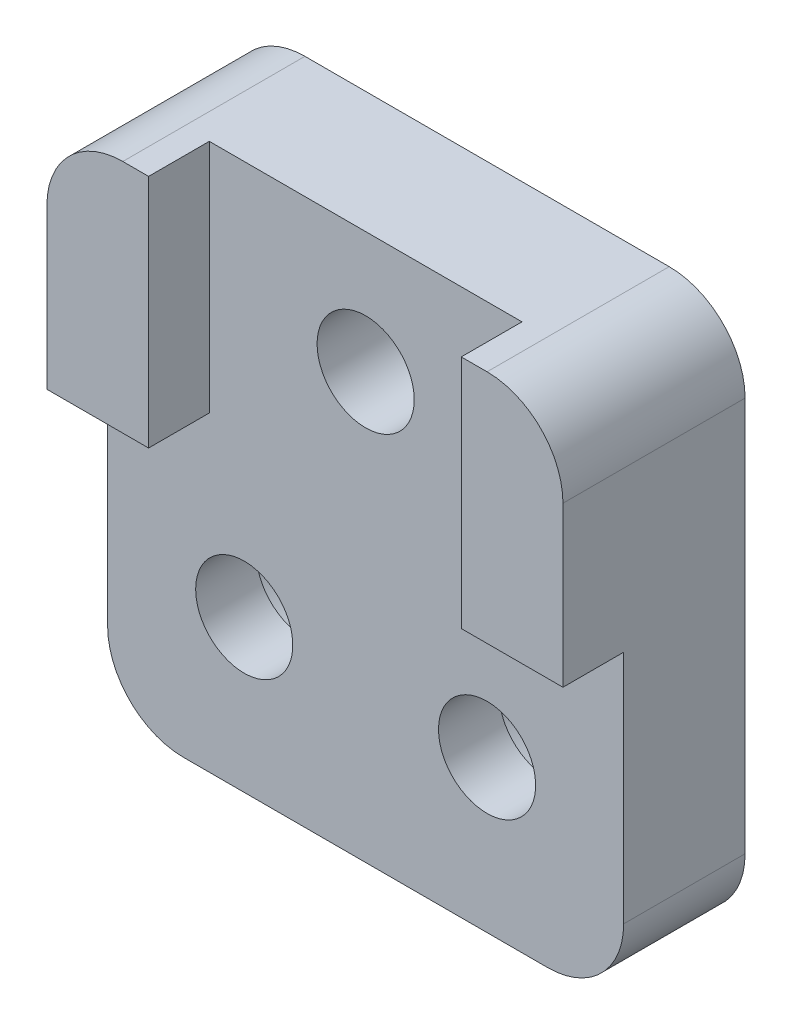
ISO-10303-21;
HEADER;
FILE_DESCRIPTION(('STEP AP214'),'2;1');
FILE_NAME('part.step','',(''),(''),'','','');
FILE_SCHEMA(('AUTOMOTIVE_DESIGN { 1 0 10303 214 1 1 1 1 }'));
ENDSEC;
DATA;
#1=APPLICATION_CONTEXT('core data for automotive mechanical design processes');
#2=APPLICATION_PROTOCOL_DEFINITION('international standard','automotive_design',2000,#1);
#3=PRODUCT_CONTEXT('',#1,'mechanical');
#4=PRODUCT('Part','Part','',(#3));
#5=PRODUCT_RELATED_PRODUCT_CATEGORY('part','',(#4));
#6=PRODUCT_DEFINITION_FORMATION('','',#4);
#7=PRODUCT_DEFINITION_CONTEXT('part definition',#1,'design');
#8=PRODUCT_DEFINITION('design','',#6,#7);
#9=PRODUCT_DEFINITION_SHAPE('','',#8);
#10=(LENGTH_UNIT() NAMED_UNIT(*) SI_UNIT(.MILLI.,.METRE.));
#11=(NAMED_UNIT(*) PLANE_ANGLE_UNIT() SI_UNIT($,.RADIAN.));
#12=(NAMED_UNIT(*) SI_UNIT($,.STERADIAN.) SOLID_ANGLE_UNIT());
#13=UNCERTAINTY_MEASURE_WITH_UNIT(LENGTH_MEASURE(1.E-05),#10,'distance_accuracy_value','');
#14=(GEOMETRIC_REPRESENTATION_CONTEXT(3) GLOBAL_UNCERTAINTY_ASSIGNED_CONTEXT((#13)) GLOBAL_UNIT_ASSIGNED_CONTEXT((#10,
#11,#12)) REPRESENTATION_CONTEXT('',''));
#15=CARTESIAN_POINT('',(0.,0.,0.));
#16=DIRECTION('',(0.,0.,1.));
#17=DIRECTION('',(1.,0.,0.));
#18=AXIS2_PLACEMENT_3D('',#15,#16,#17);
#19=CARTESIAN_POINT('',(-17.,28.,0.));
#20=DIRECTION('',(0.,0.,1.));
#21=DIRECTION('',(1.,0.,0.));
#22=AXIS2_PLACEMENT_3D('',#19,#20,#21);
#23=CYLINDRICAL_SURFACE('',#22,3.2);
#24=CARTESIAN_POINT('',(-17.00000000001,28.00000000001,4.00000000001));
#25=DIRECTION('',(0.,0.,-1.));
#26=DIRECTION('',(-1.,0.,0.));
#27=AXIS2_PLACEMENT_3D('',#24,#25,#26);
#28=CIRCLE('',#27,3.20000000001);
#29=CARTESIAN_POINT('',(-20.20000000002,28.00000000001,4.00000000001));
#30=VERTEX_POINT('',#29);
#31=EDGE_CURVE('E213',#30,#30,#28,.T.);
#32=ORIENTED_EDGE('',*,*,#31,.F.);
#33=EDGE_LOOP('',(#32));
#34=FACE_BOUND('',#33,.T.);
#35=CARTESIAN_POINT('',(-17.00000000001,28.00000000001,-4.00000000001));
#36=DIRECTION('',(0.,0.,-1.));
#37=DIRECTION('',(1.,0.,0.));
#38=AXIS2_PLACEMENT_3D('',#35,#36,#37);
#39=CIRCLE('',#38,3.20000000001);
#40=CARTESIAN_POINT('',(-13.8,28.00000000001,-4.00000000001));
#41=VERTEX_POINT('',#40);
#42=EDGE_CURVE('E11',#41,#41,#39,.T.);
#43=ORIENTED_EDGE('',*,*,#42,.T.);
#44=EDGE_LOOP('',(#43));
#45=FACE_BOUND('',#44,.T.);
#46=ADVANCED_FACE('F17',(#34,#45),#23,.F.);
#47=CARTESIAN_POINT('',(-25.,10.,0.));
#48=DIRECTION('',(0.,0.,1.));
#49=DIRECTION('',(1.,0.,0.));
#50=AXIS2_PLACEMENT_3D('',#47,#48,#49);
#51=CYLINDRICAL_SURFACE('',#50,6.);
#52=CARTESIAN_POINT('',(-25.00000000001,10.00000000001,0.));
#53=DIRECTION('',(0.,0.,-1.));
#54=DIRECTION('',(1.,0.,0.));
#55=AXIS2_PLACEMENT_3D('',#52,#53,#54);
#56=CIRCLE('',#55,6.00000000001);
#57=CARTESIAN_POINT('',(-19.,10.00000000001,0.));
#58=VERTEX_POINT('',#57);
#59=EDGE_CURVE('E224',#58,#58,#56,.T.);
#60=ORIENTED_EDGE('',*,*,#59,.F.);
#61=EDGE_LOOP('',(#60));
#62=FACE_BOUND('',#61,.T.);
#63=CARTESIAN_POINT('',(-25.00000000001,10.00000000001,-4.00000000001));
#64=DIRECTION('',(0.,0.,-1.));
#65=DIRECTION('',(1.,0.,0.));
#66=AXIS2_PLACEMENT_3D('',#63,#64,#65);
#67=CIRCLE('',#66,6.00000000001);
#68=CARTESIAN_POINT('',(-19.,10.00000000001,-4.00000000001));
#69=VERTEX_POINT('',#68);
#70=EDGE_CURVE('E28',#69,#69,#67,.T.);
#71=ORIENTED_EDGE('',*,*,#70,.T.);
#72=EDGE_LOOP('',(#71));
#73=FACE_BOUND('',#72,.T.);
#74=ADVANCED_FACE('F402',(#62,#73),#51,.F.);
#75=CARTESIAN_POINT('',(-9.,10.,0.));
#76=DIRECTION('',(0.,0.,1.));
#77=DIRECTION('',(1.,0.,0.));
#78=AXIS2_PLACEMENT_3D('',#75,#76,#77);
#79=CYLINDRICAL_SURFACE('',#78,6.);
#80=CARTESIAN_POINT('',(-9.00000000001,10.00000000001,0.));
#81=DIRECTION('',(0.,0.,-1.));
#82=DIRECTION('',(1.,0.,0.));
#83=AXIS2_PLACEMENT_3D('',#80,#81,#82);
#84=CIRCLE('',#83,6.00000000001);
#85=CARTESIAN_POINT('',(-3.,10.00000000001,0.));
#86=VERTEX_POINT('',#85);
#87=EDGE_CURVE('E221',#86,#86,#84,.T.);
#88=ORIENTED_EDGE('',*,*,#87,.F.);
#89=EDGE_LOOP('',(#88));
#90=FACE_BOUND('',#89,.T.);
#91=CARTESIAN_POINT('',(-9.00000000001,10.00000000001,-4.00000000001));
#92=DIRECTION('',(0.,0.,-1.));
#93=DIRECTION('',(1.,0.,0.));
#94=AXIS2_PLACEMENT_3D('',#91,#92,#93);
#95=CIRCLE('',#94,6.00000000001);
#96=CARTESIAN_POINT('',(-3.,10.00000000001,-4.00000000001));
#97=VERTEX_POINT('',#96);
#98=EDGE_CURVE('E275',#97,#97,#95,.T.);
#99=ORIENTED_EDGE('',*,*,#98,.T.);
#100=EDGE_LOOP('',(#99));
#101=FACE_BOUND('',#100,.T.);
#102=ADVANCED_FACE('F408',(#90,#101),#79,.F.);
#103=CARTESIAN_POINT('',(-25.,10.,0.));
#104=DIRECTION('',(0.,0.,-1.));
#105=DIRECTION('',(-1.,0.,0.));
#106=AXIS2_PLACEMENT_3D('',#103,#104,#105);
#107=CYLINDRICAL_SURFACE('',#106,3.2);
#108=CARTESIAN_POINT('',(-25.00000000001,10.00000000001,0.));
#109=DIRECTION('',(0.,0.,-1.));
#110=DIRECTION('',(-1.,0.,0.));
#111=AXIS2_PLACEMENT_3D('',#108,#109,#110);
#112=CIRCLE('',#111,3.20000000001);
#113=CARTESIAN_POINT('',(-28.20000000002,10.00000000001,0.));
#114=VERTEX_POINT('',#113);
#115=EDGE_CURVE('E318',#114,#114,#112,.T.);
#116=ORIENTED_EDGE('',*,*,#115,.T.);
#117=EDGE_LOOP('',(#116));
#118=FACE_BOUND('',#117,.T.);
#119=CARTESIAN_POINT('',(-25.00000000001,10.00000000001,4.00000000001));
#120=DIRECTION('',(0.,0.,-1.));
#121=DIRECTION('',(-1.,0.,0.));
#122=AXIS2_PLACEMENT_3D('',#119,#120,#121);
#123=CIRCLE('',#122,3.20000000001);
#124=CARTESIAN_POINT('',(-28.20000000002,10.00000000001,4.00000000001));
#125=VERTEX_POINT('',#124);
#126=EDGE_CURVE('E281',#125,#125,#123,.T.);
#127=ORIENTED_EDGE('',*,*,#126,.F.);
#128=EDGE_LOOP('',(#127));
#129=FACE_BOUND('',#128,.T.);
#130=ADVANCED_FACE('F430',(#118,#129),#107,.F.);
#131=CARTESIAN_POINT('',(-9.,10.,0.));
#132=DIRECTION('',(0.,0.,-1.));
#133=DIRECTION('',(-1.,0.,0.));
#134=AXIS2_PLACEMENT_3D('',#131,#132,#133);
#135=CYLINDRICAL_SURFACE('',#134,3.2);
#136=CARTESIAN_POINT('',(-9.00000000001,10.00000000001,0.));
#137=DIRECTION('',(0.,0.,-1.));
#138=DIRECTION('',(-1.,0.,0.));
#139=AXIS2_PLACEMENT_3D('',#136,#137,#138);
#140=CIRCLE('',#139,3.20000000001);
#141=CARTESIAN_POINT('',(-12.20000000002,10.00000000001,0.));
#142=VERTEX_POINT('',#141);
#143=EDGE_CURVE('E337',#142,#142,#140,.T.);
#144=ORIENTED_EDGE('',*,*,#143,.T.);
#145=EDGE_LOOP('',(#144));
#146=FACE_BOUND('',#145,.T.);
#147=CARTESIAN_POINT('',(-9.00000000001,10.00000000001,4.00000000001));
#148=DIRECTION('',(0.,0.,-1.));
#149=DIRECTION('',(-1.,0.,0.));
#150=AXIS2_PLACEMENT_3D('',#147,#148,#149);
#151=CIRCLE('',#150,3.20000000001);
#152=CARTESIAN_POINT('',(-12.20000000002,10.00000000001,4.00000000001));
#153=VERTEX_POINT('',#152);
#154=EDGE_CURVE('E300',#153,#153,#151,.T.);
#155=ORIENTED_EDGE('',*,*,#154,.F.);
#156=EDGE_LOOP('',(#155));
#157=FACE_BOUND('',#156,.T.);
#158=ADVANCED_FACE('F433',(#146,#157),#135,.F.);
#159=CARTESIAN_POINT('',(-5.000000000001,0.,-4.));
#160=DIRECTION('',(0.,0.,1.));
#161=DIRECTION('',(1.,0.,0.));
#162=AXIS2_PLACEMENT_3D('',#159,#160,#161);
#163=PLANE('',#162);
#164=CARTESIAN_POINT('',(-29.00000000001,5.00000000001,-4.00000000001));
#165=DIRECTION('',(0.,0.,1.));
#166=DIRECTION('',(1.,0.,0.));
#167=AXIS2_PLACEMENT_3D('',#164,#165,#166);
#168=CIRCLE('',#167,5.00000000001);
#169=CARTESIAN_POINT('',(-34.,5.,-4.));
#170=VERTEX_POINT('',#169);
#171=CARTESIAN_POINT('',(-29.,0.,-4.));
#172=VERTEX_POINT('',#171);
#173=EDGE_CURVE('E326',#170,#172,#168,.T.);
#174=ORIENTED_EDGE('',*,*,#173,.F.);
#175=DIRECTION('',(0.,-1.,0.));
#176=VECTOR('',#175,1.);
#177=CARTESIAN_POINT('',(-34.00000000001,0.,-4.00000000001));
#178=LINE('',#177,#176);
#179=CARTESIAN_POINT('',(-34.,31.0000000000005,-4.));
#180=VERTEX_POINT('',#179);
#181=EDGE_CURVE('E43',#180,#170,#178,.T.);
#182=ORIENTED_EDGE('',*,*,#181,.F.);
#183=CARTESIAN_POINT('',(-29.00000000001,31.00000000001,-4.00000000001));
#184=DIRECTION('',(0.,0.,1.));
#185=DIRECTION('',(1.,0.,0.));
#186=AXIS2_PLACEMENT_3D('',#183,#184,#185);
#187=CIRCLE('',#186,5.00000000001);
#188=CARTESIAN_POINT('',(-29.,36.,-4.));
#189=VERTEX_POINT('',#188);
#190=EDGE_CURVE('E312',#189,#180,#187,.T.);
#191=ORIENTED_EDGE('',*,*,#190,.F.);
#192=DIRECTION('',(-1.,0.,0.));
#193=VECTOR('',#192,1.);
#194=CARTESIAN_POINT('',(-5.000000000011,36.00000000001,-4.00000000001));
#195=LINE('',#194,#193);
#196=CARTESIAN_POINT('',(-4.999999999999,36.,-4.));
#197=VERTEX_POINT('',#196);
#198=EDGE_CURVE('E199',#197,#189,#195,.T.);
#199=ORIENTED_EDGE('',*,*,#198,.F.);
#200=CARTESIAN_POINT('',(-5.00000000001,31.00000000001,-4.00000000001));
#201=DIRECTION('',(0.,0.,1.));
#202=DIRECTION('',(1.,0.,0.));
#203=AXIS2_PLACEMENT_3D('',#200,#201,#202);
#204=CIRCLE('',#203,5.00000000001);
#205=CARTESIAN_POINT('',(0.,31.,-4.));
#206=VERTEX_POINT('',#205);
#207=EDGE_CURVE('E260',#206,#197,#204,.T.);
#208=ORIENTED_EDGE('',*,*,#207,.F.);
#209=DIRECTION('',(0.,1.,0.));
#210=VECTOR('',#209,1.);
#211=CARTESIAN_POINT('',(0.,0.,-4.00000000001));
#212=LINE('',#211,#210);
#213=CARTESIAN_POINT('',(0.,5.,-4.));
#214=VERTEX_POINT('',#213);
#215=EDGE_CURVE('E267',#214,#206,#212,.T.);
#216=ORIENTED_EDGE('',*,*,#215,.F.);
#217=CARTESIAN_POINT('',(-5.00000000001,5.00000000001,-4.00000000001));
#218=DIRECTION('',(0.,0.,1.));
#219=DIRECTION('',(1.,0.,0.));
#220=AXIS2_PLACEMENT_3D('',#217,#218,#219);
#221=CIRCLE('',#220,5.00000000001);
#222=CARTESIAN_POINT('',(-5.,0.,-4.));
#223=VERTEX_POINT('',#222);
#224=EDGE_CURVE('E269',#223,#214,#221,.T.);
#225=ORIENTED_EDGE('',*,*,#224,.F.);
#226=DIRECTION('',(1.,0.,0.));
#227=VECTOR('',#226,1.);
#228=CARTESIAN_POINT('',(-5.000000000011,0.,-4.00000000001));
#229=LINE('',#228,#227);
#230=EDGE_CURVE('E325',#172,#223,#229,.T.);
#231=ORIENTED_EDGE('',*,*,#230,.F.);
#232=EDGE_LOOP('',(#174,#182,#191,#199,#208,#216,#225,#231));
#233=FACE_BOUND('',#232,.T.);
#234=ORIENTED_EDGE('',*,*,#42,.F.);
#235=EDGE_LOOP('',(#234));
#236=FACE_BOUND('',#235,.T.);
#237=ORIENTED_EDGE('',*,*,#70,.F.);
#238=EDGE_LOOP('',(#237));
#239=FACE_BOUND('',#238,.T.);
#240=ORIENTED_EDGE('',*,*,#98,.F.);
#241=EDGE_LOOP('',(#240));
#242=FACE_BOUND('',#241,.T.);
#243=ADVANCED_FACE('F381',(#233,#236,#239,#242),#163,.F.);
#244=CARTESIAN_POINT('',(-5.000000000001,0.,0.));
#245=DIRECTION('',(0.,1.,0.));
#246=DIRECTION('',(1.,0.,0.));
#247=AXIS2_PLACEMENT_3D('',#244,#245,#246);
#248=PLANE('',#247);
#249=DIRECTION('',(0.,0.,1.));
#250=VECTOR('',#249,1.);
#251=CARTESIAN_POINT('',(-29.00000000001,0.,0.));
#252=LINE('',#251,#250);
#253=CARTESIAN_POINT('',(-29.,0.,4.));
#254=VERTEX_POINT('',#253);
#255=EDGE_CURVE('E311',#172,#254,#252,.T.);
#256=ORIENTED_EDGE('',*,*,#255,.F.);
#257=ORIENTED_EDGE('',*,*,#230,.T.);
#258=DIRECTION('',(0.,0.,-1.));
#259=VECTOR('',#258,1.);
#260=CARTESIAN_POINT('',(-5.00000000001,0.,0.));
#261=LINE('',#260,#259);
#262=CARTESIAN_POINT('',(-5.,0.,4.));
#263=VERTEX_POINT('',#262);
#264=EDGE_CURVE('E233',#263,#223,#261,.T.);
#265=ORIENTED_EDGE('',*,*,#264,.F.);
#266=DIRECTION('',(-1.,0.,0.));
#267=VECTOR('',#266,1.);
#268=CARTESIAN_POINT('',(0.,0.,4.00000000001));
#269=LINE('',#268,#267);
#270=EDGE_CURVE('E322',#263,#254,#269,.T.);
#271=ORIENTED_EDGE('',*,*,#270,.T.);
#272=EDGE_LOOP('',(#256,#257,#265,#271));
#273=FACE_BOUND('',#272,.T.);
#274=ADVANCED_FACE('F378',(#273),#248,.F.);
#275=CARTESIAN_POINT('',(-29.,5.,0.));
#276=DIRECTION('',(0.,0.,1.));
#277=DIRECTION('',(1.,0.,0.));
#278=AXIS2_PLACEMENT_3D('',#275,#276,#277);
#279=CYLINDRICAL_SURFACE('',#278,5.);
#280=ORIENTED_EDGE('',*,*,#173,.T.);
#281=ORIENTED_EDGE('',*,*,#255,.T.);
#282=CARTESIAN_POINT('',(-29.00000000001,5.00000000001,4.00000000001));
#283=DIRECTION('',(0.,0.,-1.));
#284=DIRECTION('',(1.,0.,0.));
#285=AXIS2_PLACEMENT_3D('',#282,#283,#284);
#286=CIRCLE('',#285,5.00000000001);
#287=CARTESIAN_POINT('',(-34.,5.,4.));
#288=VERTEX_POINT('',#287);
#289=EDGE_CURVE('E307',#254,#288,#286,.T.);
#290=ORIENTED_EDGE('',*,*,#289,.T.);
#291=DIRECTION('',(0.,0.,-1.));
#292=VECTOR('',#291,1.);
#293=CARTESIAN_POINT('',(-34.00000000001,5.00000000001,0.));
#294=LINE('',#293,#292);
#295=EDGE_CURVE('E306',#288,#170,#294,.T.);
#296=ORIENTED_EDGE('',*,*,#295,.T.);
#297=EDGE_LOOP('',(#280,#281,#290,#296));
#298=FACE_BOUND('',#297,.T.);
#299=ADVANCED_FACE('F413',(#298),#279,.T.);
#300=CARTESIAN_POINT('',(-34.,5.,0.));
#301=DIRECTION('',(1.,0.,0.));
#302=DIRECTION('',(0.,1.,0.));
#303=AXIS2_PLACEMENT_3D('',#300,#301,#302);
#304=PLANE('',#303);
#305=DIRECTION('',(0.,0.,1.));
#306=VECTOR('',#305,1.);
#307=CARTESIAN_POINT('',(-34.00000000001,31.000000000011,0.));
#308=LINE('',#307,#306);
#309=CARTESIAN_POINT('',(-34.,31.,8.));
#310=VERTEX_POINT('',#309);
#311=EDGE_CURVE('E294',#180,#310,#308,.T.);
#312=ORIENTED_EDGE('',*,*,#311,.F.);
#313=ORIENTED_EDGE('',*,*,#181,.T.);
#314=ORIENTED_EDGE('',*,*,#295,.F.);
#315=DIRECTION('',(0.,1.,0.));
#316=VECTOR('',#315,1.);
#317=CARTESIAN_POINT('',(-34.00000000001,0.,4.00000000001));
#318=LINE('',#317,#316);
#319=CARTESIAN_POINT('',(-34.,20.5,4.));
#320=VERTEX_POINT('',#319);
#321=EDGE_CURVE('E216',#288,#320,#318,.T.);
#322=ORIENTED_EDGE('',*,*,#321,.T.);
#323=DIRECTION('',(0.,0.,1.));
#324=VECTOR('',#323,1.);
#325=CARTESIAN_POINT('',(-34.00000000001,20.50000000001,4.00000000001));
#326=LINE('',#325,#324);
#327=CARTESIAN_POINT('',(-34.,20.5,8.));
#328=VERTEX_POINT('',#327);
#329=EDGE_CURVE('E220',#320,#328,#326,.T.);
#330=ORIENTED_EDGE('',*,*,#329,.T.);
#331=DIRECTION('',(0.,1.,0.));
#332=VECTOR('',#331,1.);
#333=CARTESIAN_POINT('',(-34.00000000001,20.50000000001,8.00000000001));
#334=LINE('',#333,#332);
#335=EDGE_CURVE('E315',#328,#310,#334,.T.);
#336=ORIENTED_EDGE('',*,*,#335,.T.);
#337=EDGE_LOOP('',(#312,#313,#314,#322,#330,#336));
#338=FACE_BOUND('',#337,.T.);
#339=ADVANCED_FACE('F416',(#338),#304,.F.);
#340=CARTESIAN_POINT('',(-29.,31.,0.));
#341=DIRECTION('',(0.,0.,1.));
#342=DIRECTION('',(1.,0.,0.));
#343=AXIS2_PLACEMENT_3D('',#340,#341,#342);
#344=CYLINDRICAL_SURFACE('',#343,5.);
#345=ORIENTED_EDGE('',*,*,#190,.T.);
#346=ORIENTED_EDGE('',*,*,#311,.T.);
#347=CARTESIAN_POINT('',(-29.00000000001,31.00000000001,8.00000000001));
#348=DIRECTION('',(0.,0.,-1.));
#349=DIRECTION('',(1.,0.,0.));
#350=AXIS2_PLACEMENT_3D('',#347,#348,#349);
#351=CIRCLE('',#350,5.00000000001);
#352=CARTESIAN_POINT('',(-29.,36.,8.));
#353=VERTEX_POINT('',#352);
#354=EDGE_CURVE('E290',#310,#353,#351,.T.);
#355=ORIENTED_EDGE('',*,*,#354,.T.);
#356=DIRECTION('',(0.,0.,-1.));
#357=VECTOR('',#356,1.);
#358=CARTESIAN_POINT('',(-29.00000000001,36.00000000001,0.));
#359=LINE('',#358,#357);
#360=EDGE_CURVE('E283',#353,#189,#359,.T.);
#361=ORIENTED_EDGE('',*,*,#360,.T.);
#362=EDGE_LOOP('',(#345,#346,#355,#361));
#363=FACE_BOUND('',#362,.T.);
#364=ADVANCED_FACE('F19',(#363),#344,.T.);
#365=CARTESIAN_POINT('',(-29.,36.,0.));
#366=DIRECTION('',(0.,-1.,0.));
#367=DIRECTION('',(0.,0.,-1.));
#368=AXIS2_PLACEMENT_3D('',#365,#366,#367);
#369=PLANE('',#368);
#370=DIRECTION('',(0.,0.,1.));
#371=VECTOR('',#370,1.);
#372=CARTESIAN_POINT('',(-5.000000000008,36.00000000001,0.));
#373=LINE('',#372,#371);
#374=CARTESIAN_POINT('',(-5.,36.,8.));
#375=VERTEX_POINT('',#374);
#376=EDGE_CURVE('E351',#197,#375,#373,.T.);
#377=ORIENTED_EDGE('',*,*,#376,.F.);
#378=ORIENTED_EDGE('',*,*,#198,.T.);
#379=ORIENTED_EDGE('',*,*,#360,.F.);
#380=DIRECTION('',(-1.,0.,0.));
#381=VECTOR('',#380,1.);
#382=CARTESIAN_POINT('',(-34.00000000001,36.00000000001,8.00000000001));
#383=LINE('',#382,#381);
#384=CARTESIAN_POINT('',(-27.3,36.,8.));
#385=VERTEX_POINT('',#384);
#386=EDGE_CURVE('E183',#385,#353,#383,.T.);
#387=ORIENTED_EDGE('',*,*,#386,.F.);
#388=DIRECTION('',(0.,0.,1.));
#389=VECTOR('',#388,1.);
#390=CARTESIAN_POINT('',(-27.30000000001,36.00000000001,4.00000000001));
#391=LINE('',#390,#389);
#392=CARTESIAN_POINT('',(-27.3,36.,4.));
#393=VERTEX_POINT('',#392);
#394=EDGE_CURVE('E176',#393,#385,#391,.T.);
#395=ORIENTED_EDGE('',*,*,#394,.F.);
#396=DIRECTION('',(1.,0.,0.));
#397=VECTOR('',#396,1.);
#398=CARTESIAN_POINT('',(-34.00000000001,36.00000000001,4.00000000001));
#399=LINE('',#398,#397);
#400=CARTESIAN_POINT('',(-6.7,36.,4.));
#401=VERTEX_POINT('',#400);
#402=EDGE_CURVE('E181',#393,#401,#399,.T.);
#403=ORIENTED_EDGE('',*,*,#402,.T.);
#404=DIRECTION('',(0.,0.,1.));
#405=VECTOR('',#404,1.);
#406=CARTESIAN_POINT('',(-6.70000000001,36.00000000001,4.00000000001));
#407=LINE('',#406,#405);
#408=CARTESIAN_POINT('',(-6.7,36.,8.));
#409=VERTEX_POINT('',#408);
#410=EDGE_CURVE('E200',#401,#409,#407,.T.);
#411=ORIENTED_EDGE('',*,*,#410,.T.);
#412=DIRECTION('',(1.,0.,0.));
#413=VECTOR('',#412,1.);
#414=CARTESIAN_POINT('',(0.,36.00000000001,8.00000000001));
#415=LINE('',#414,#413);
#416=EDGE_CURVE('E285',#409,#375,#415,.T.);
#417=ORIENTED_EDGE('',*,*,#416,.T.);
#418=EDGE_LOOP('',(#377,#378,#379,#387,#395,#403,#411,#417));
#419=FACE_BOUND('',#418,.T.);
#420=ADVANCED_FACE('F179',(#419),#369,.F.);
#421=CARTESIAN_POINT('',(-5.,31.,0.));
#422=DIRECTION('',(0.,0.,1.));
#423=DIRECTION('',(1.,0.,0.));
#424=AXIS2_PLACEMENT_3D('',#421,#422,#423);
#425=CYLINDRICAL_SURFACE('',#424,5.);
#426=ORIENTED_EDGE('',*,*,#207,.T.);
#427=ORIENTED_EDGE('',*,*,#376,.T.);
#428=CARTESIAN_POINT('',(-5.00000000001,31.00000000001,8.00000000001));
#429=DIRECTION('',(0.,0.,-1.));
#430=DIRECTION('',(1.,0.,0.));
#431=AXIS2_PLACEMENT_3D('',#428,#429,#430);
#432=CIRCLE('',#431,5.00000000001);
#433=CARTESIAN_POINT('',(0.,31.,8.));
#434=VERTEX_POINT('',#433);
#435=EDGE_CURVE('E21',#375,#434,#432,.T.);
#436=ORIENTED_EDGE('',*,*,#435,.T.);
#437=DIRECTION('',(0.,0.,-1.));
#438=VECTOR('',#437,1.);
#439=CARTESIAN_POINT('',(0.,31.00000000001,0.));
#440=LINE('',#439,#438);
#441=EDGE_CURVE('E264',#434,#206,#440,.T.);
#442=ORIENTED_EDGE('',*,*,#441,.T.);
#443=EDGE_LOOP('',(#426,#427,#436,#442));
#444=FACE_BOUND('',#443,.T.);
#445=ADVANCED_FACE('F388',(#444),#425,.T.);
#446=CARTESIAN_POINT('',(0.,30.999999999998,0.));
#447=DIRECTION('',(-1.,0.,0.));
#448=DIRECTION('',(0.,0.,1.));
#449=AXIS2_PLACEMENT_3D('',#446,#447,#448);
#450=PLANE('',#449);
#451=DIRECTION('',(0.,0.,1.));
#452=VECTOR('',#451,1.);
#453=CARTESIAN_POINT('',(0.,5.00000000001,0.));
#454=LINE('',#453,#452);
#455=CARTESIAN_POINT('',(0.,5.,4.));
#456=VERTEX_POINT('',#455);
#457=EDGE_CURVE('E111',#214,#456,#454,.T.);
#458=ORIENTED_EDGE('',*,*,#457,.F.);
#459=ORIENTED_EDGE('',*,*,#215,.T.);
#460=ORIENTED_EDGE('',*,*,#441,.F.);
#461=DIRECTION('',(0.,1.,0.));
#462=VECTOR('',#461,1.);
#463=CARTESIAN_POINT('',(0.,20.50000000001,8.00000000001));
#464=LINE('',#463,#462);
#465=CARTESIAN_POINT('',(0.,20.5,8.));
#466=VERTEX_POINT('',#465);
#467=EDGE_CURVE('E263',#466,#434,#464,.T.);
#468=ORIENTED_EDGE('',*,*,#467,.F.);
#469=DIRECTION('',(0.,0.,1.));
#470=VECTOR('',#469,1.);
#471=CARTESIAN_POINT('',(0.,20.50000000001,4.00000000001));
#472=LINE('',#471,#470);
#473=CARTESIAN_POINT('',(0.,20.5,4.));
#474=VERTEX_POINT('',#473);
#475=EDGE_CURVE('E96',#474,#466,#472,.T.);
#476=ORIENTED_EDGE('',*,*,#475,.F.);
#477=DIRECTION('',(0.,-1.,0.));
#478=VECTOR('',#477,1.);
#479=CARTESIAN_POINT('',(0.,36.00000000001,4.00000000001));
#480=LINE('',#479,#478);
#481=EDGE_CURVE('E241',#474,#456,#480,.T.);
#482=ORIENTED_EDGE('',*,*,#481,.T.);
#483=EDGE_LOOP('',(#458,#459,#460,#468,#476,#482));
#484=FACE_BOUND('',#483,.T.);
#485=ADVANCED_FACE('F386',(#484),#450,.F.);
#486=CARTESIAN_POINT('',(-5.,5.,0.));
#487=DIRECTION('',(0.,0.,1.));
#488=DIRECTION('',(1.,0.,0.));
#489=AXIS2_PLACEMENT_3D('',#486,#487,#488);
#490=CYLINDRICAL_SURFACE('',#489,5.);
#491=ORIENTED_EDGE('',*,*,#224,.T.);
#492=ORIENTED_EDGE('',*,*,#457,.T.);
#493=CARTESIAN_POINT('',(-5.00000000001,5.00000000001,4.00000000001));
#494=DIRECTION('',(0.,0.,-1.));
#495=DIRECTION('',(1.,0.,0.));
#496=AXIS2_PLACEMENT_3D('',#493,#494,#495);
#497=CIRCLE('',#496,5.00000000001);
#498=EDGE_CURVE('E299',#456,#263,#497,.T.);
#499=ORIENTED_EDGE('',*,*,#498,.T.);
#500=ORIENTED_EDGE('',*,*,#264,.T.);
#501=EDGE_LOOP('',(#491,#492,#499,#500));
#502=FACE_BOUND('',#501,.T.);
#503=ADVANCED_FACE('F373',(#502),#490,.T.);
#504=CARTESIAN_POINT('',(0.,0.,0.));
#505=DIRECTION('',(0.,0.,1.));
#506=DIRECTION('',(1.,0.,0.));
#507=AXIS2_PLACEMENT_3D('',#504,#505,#506);
#508=PLANE('',#507);
#509=ORIENTED_EDGE('',*,*,#59,.T.);
#510=EDGE_LOOP('',(#509));
#511=FACE_BOUND('',#510,.T.);
#512=ORIENTED_EDGE('',*,*,#115,.F.);
#513=EDGE_LOOP('',(#512));
#514=FACE_BOUND('',#513,.T.);
#515=ADVANCED_FACE('F395',(#511,#514),#508,.F.);
#516=ORIENTED_EDGE('',*,*,#87,.T.);
#517=EDGE_LOOP('',(#516));
#518=FACE_BOUND('',#517,.T.);
#519=ORIENTED_EDGE('',*,*,#143,.F.);
#520=EDGE_LOOP('',(#519));
#521=FACE_BOUND('',#520,.T.);
#522=ADVANCED_FACE('F429',(#518,#521),#508,.F.);
#523=CARTESIAN_POINT('',(0.,0.,4.));
#524=DIRECTION('',(0.,0.,1.));
#525=DIRECTION('',(1.,0.,0.));
#526=AXIS2_PLACEMENT_3D('',#523,#524,#525);
#527=PLANE('',#526);
#528=ORIENTED_EDGE('',*,*,#321,.F.);
#529=ORIENTED_EDGE('',*,*,#289,.F.);
#530=ORIENTED_EDGE('',*,*,#270,.F.);
#531=ORIENTED_EDGE('',*,*,#498,.F.);
#532=ORIENTED_EDGE('',*,*,#481,.F.);
#533=DIRECTION('',(-1.,0.,0.));
#534=VECTOR('',#533,1.);
#535=CARTESIAN_POINT('',(0.,20.50000000001,4.00000000001));
#536=LINE('',#535,#534);
#537=CARTESIAN_POINT('',(-6.7,20.5,4.));
#538=VERTEX_POINT('',#537);
#539=EDGE_CURVE('E210',#474,#538,#536,.T.);
#540=ORIENTED_EDGE('',*,*,#539,.T.);
#541=DIRECTION('',(0.,1.,0.));
#542=VECTOR('',#541,1.);
#543=CARTESIAN_POINT('',(-6.70000000001,0.,4.00000000001));
#544=LINE('',#543,#542);
#545=EDGE_CURVE('E122',#538,#401,#544,.T.);
#546=ORIENTED_EDGE('',*,*,#545,.T.);
#547=ORIENTED_EDGE('',*,*,#402,.F.);
#548=DIRECTION('',(0.,-1.,0.));
#549=VECTOR('',#548,1.);
#550=CARTESIAN_POINT('',(-27.30000000001,0.,4.00000000001));
#551=LINE('',#550,#549);
#552=CARTESIAN_POINT('',(-27.3,20.5,4.));
#553=VERTEX_POINT('',#552);
#554=EDGE_CURVE('E197',#393,#553,#551,.T.);
#555=ORIENTED_EDGE('',*,*,#554,.T.);
#556=EDGE_CURVE('E206',#553,#320,#536,.T.);
#557=ORIENTED_EDGE('',*,*,#556,.T.);
#558=EDGE_LOOP('',(#528,#529,#530,#531,#532,#540,#546,#547,#555,#557));
#559=FACE_BOUND('',#558,.T.);
#560=ORIENTED_EDGE('',*,*,#31,.T.);
#561=EDGE_LOOP('',(#560));
#562=FACE_BOUND('',#561,.T.);
#563=ORIENTED_EDGE('',*,*,#126,.T.);
#564=EDGE_LOOP('',(#563));
#565=FACE_BOUND('',#564,.T.);
#566=ORIENTED_EDGE('',*,*,#154,.T.);
#567=EDGE_LOOP('',(#566));
#568=FACE_BOUND('',#567,.T.);
#569=ADVANCED_FACE('F194',(#559,#562,#565,#568),#527,.T.);
#570=CARTESIAN_POINT('',(-27.3,20.5,4.));
#571=DIRECTION('',(0.,-1.,0.));
#572=DIRECTION('',(0.,0.,-1.));
#573=AXIS2_PLACEMENT_3D('',#570,#571,#572);
#574=PLANE('',#573);
#575=ORIENTED_EDGE('',*,*,#329,.F.);
#576=ORIENTED_EDGE('',*,*,#556,.F.);
#577=DIRECTION('',(0.,0.,1.));
#578=VECTOR('',#577,1.);
#579=CARTESIAN_POINT('',(-27.30000000001,20.50000000001,4.00000000001));
#580=LINE('',#579,#578);
#581=CARTESIAN_POINT('',(-27.3,20.5,8.));
#582=VERTEX_POINT('',#581);
#583=EDGE_CURVE('E204',#553,#582,#580,.T.);
#584=ORIENTED_EDGE('',*,*,#583,.T.);
#585=DIRECTION('',(-1.,0.,0.));
#586=VECTOR('',#585,1.);
#587=CARTESIAN_POINT('',(-27.30000000001,20.50000000001,8.00000000001));
#588=LINE('',#587,#586);
#589=EDGE_CURVE('E188',#582,#328,#588,.T.);
#590=ORIENTED_EDGE('',*,*,#589,.T.);
#591=EDGE_LOOP('',(#575,#576,#584,#590));
#592=FACE_BOUND('',#591,.T.);
#593=ADVANCED_FACE('F428',(#592),#574,.T.);
#594=CARTESIAN_POINT('',(-27.3,36.,4.));
#595=DIRECTION('',(1.,0.,0.));
#596=DIRECTION('',(0.,1.,0.));
#597=AXIS2_PLACEMENT_3D('',#594,#595,#596);
#598=PLANE('',#597);
#599=ORIENTED_EDGE('',*,*,#583,.F.);
#600=ORIENTED_EDGE('',*,*,#554,.F.);
#601=ORIENTED_EDGE('',*,*,#394,.T.);
#602=DIRECTION('',(0.,-1.,0.));
#603=VECTOR('',#602,1.);
#604=CARTESIAN_POINT('',(-27.30000000001,36.00000000001,8.00000000001));
#605=LINE('',#604,#603);
#606=EDGE_CURVE('E189',#385,#582,#605,.T.);
#607=ORIENTED_EDGE('',*,*,#606,.T.);
#608=EDGE_LOOP('',(#599,#600,#601,#607));
#609=FACE_BOUND('',#608,.T.);
#610=ADVANCED_FACE('F202',(#609),#598,.T.);
#611=CARTESIAN_POINT('',(-6.7,36.,4.));
#612=DIRECTION('',(1.,0.,0.));
#613=DIRECTION('',(0.,1.,0.));
#614=AXIS2_PLACEMENT_3D('',#611,#612,#613);
#615=PLANE('',#614);
#616=DIRECTION('',(0.,0.,-1.));
#617=VECTOR('',#616,1.);
#618=CARTESIAN_POINT('',(-6.70000000001,20.50000000001,4.00000000001));
#619=LINE('',#618,#617);
#620=CARTESIAN_POINT('',(-6.7,20.5,8.));
#621=VERTEX_POINT('',#620);
#622=EDGE_CURVE('E244',#621,#538,#619,.T.);
#623=ORIENTED_EDGE('',*,*,#622,.F.);
#624=DIRECTION('',(0.,-1.,0.));
#625=VECTOR('',#624,1.);
#626=CARTESIAN_POINT('',(-6.70000000001,36.00000000001,8.00000000001));
#627=LINE('',#626,#625);
#628=EDGE_CURVE('E339',#409,#621,#627,.T.);
#629=ORIENTED_EDGE('',*,*,#628,.F.);
#630=ORIENTED_EDGE('',*,*,#410,.F.);
#631=ORIENTED_EDGE('',*,*,#545,.F.);
#632=EDGE_LOOP('',(#623,#629,#630,#631));
#633=FACE_BOUND('',#632,.T.);
#634=ADVANCED_FACE('F418',(#633),#615,.F.);
#635=CARTESIAN_POINT('',(-6.7,20.5,4.));
#636=DIRECTION('',(0.,1.,0.));
#637=DIRECTION('',(1.,0.,0.));
#638=AXIS2_PLACEMENT_3D('',#635,#636,#637);
#639=PLANE('',#638);
#640=ORIENTED_EDGE('',*,*,#475,.T.);
#641=DIRECTION('',(1.,0.,0.));
#642=VECTOR('',#641,1.);
#643=CARTESIAN_POINT('',(-6.70000000001,20.50000000001,8.00000000001));
#644=LINE('',#643,#642);
#645=EDGE_CURVE('E247',#621,#466,#644,.T.);
#646=ORIENTED_EDGE('',*,*,#645,.F.);
#647=ORIENTED_EDGE('',*,*,#622,.T.);
#648=ORIENTED_EDGE('',*,*,#539,.F.);
#649=EDGE_LOOP('',(#640,#646,#647,#648));
#650=FACE_BOUND('',#649,.T.);
#651=ADVANCED_FACE('F245',(#650),#639,.F.);
#652=CARTESIAN_POINT('',(-34.,36.,8.));
#653=DIRECTION('',(0.,0.,1.));
#654=DIRECTION('',(1.,0.,0.));
#655=AXIS2_PLACEMENT_3D('',#652,#653,#654);
#656=PLANE('',#655);
#657=ORIENTED_EDGE('',*,*,#589,.F.);
#658=ORIENTED_EDGE('',*,*,#606,.F.);
#659=ORIENTED_EDGE('',*,*,#386,.T.);
#660=ORIENTED_EDGE('',*,*,#354,.F.);
#661=ORIENTED_EDGE('',*,*,#335,.F.);
#662=EDGE_LOOP('',(#657,#658,#659,#660,#661));
#663=FACE_BOUND('',#662,.T.);
#664=ADVANCED_FACE('F424',(#663),#656,.T.);
#665=CARTESIAN_POINT('',(0.,36.,8.));
#666=DIRECTION('',(0.,0.,-1.));
#667=DIRECTION('',(0.,-1.,0.));
#668=AXIS2_PLACEMENT_3D('',#665,#666,#667);
#669=PLANE('',#668);
#670=ORIENTED_EDGE('',*,*,#645,.T.);
#671=ORIENTED_EDGE('',*,*,#467,.T.);
#672=ORIENTED_EDGE('',*,*,#435,.F.);
#673=ORIENTED_EDGE('',*,*,#416,.F.);
#674=ORIENTED_EDGE('',*,*,#628,.T.);
#675=EDGE_LOOP('',(#670,#671,#672,#673,#674));
#676=FACE_BOUND('',#675,.T.);
#677=ADVANCED_FACE('F421',(#676),#669,.F.);
#678=CLOSED_SHELL('',(#46,#74,#102,#130,#158,#243,#274,#299,#339,#364,#420,#445,#485,#503,#515,
#522,#569,#593,#610,#634,#651,#664,#677));
#679=MANIFOLD_SOLID_BREP('B1',#678);
#680=ADVANCED_BREP_SHAPE_REPRESENTATION('',(#18,#679),#14);
#681=SHAPE_DEFINITION_REPRESENTATION(#9,#680);
ENDSEC;
END-ISO-10303-21;
